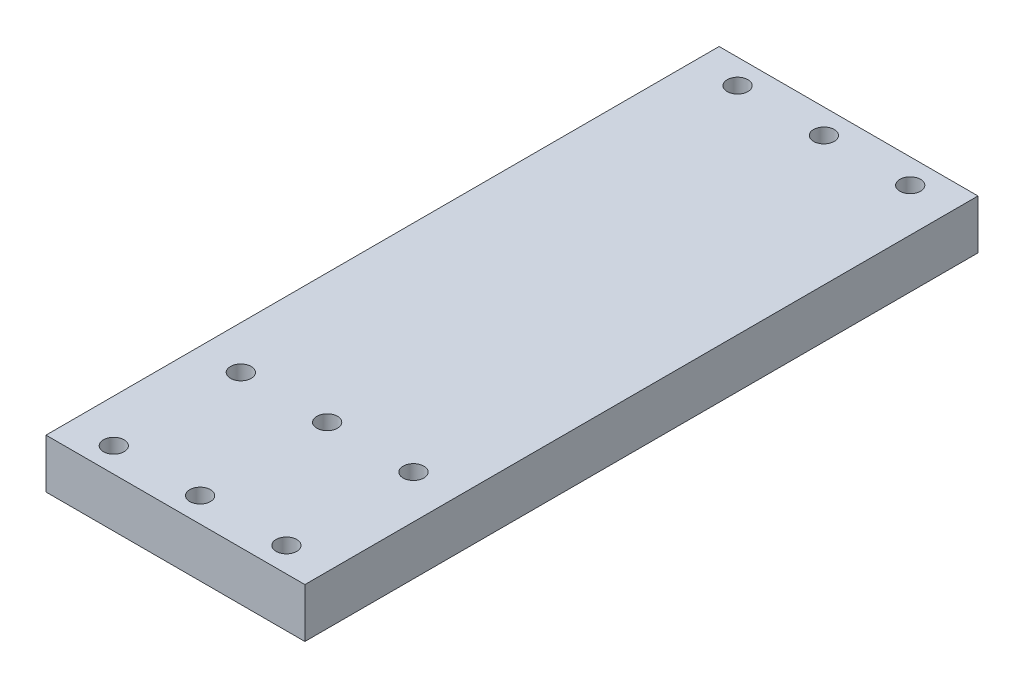
ISO-10303-21;
HEADER;
FILE_DESCRIPTION(('STEP AP214'),'2;1');
FILE_NAME('part.step','',(''),(''),'','','');
FILE_SCHEMA(('AUTOMOTIVE_DESIGN { 1 0 10303 214 1 1 1 1 }'));
ENDSEC;
DATA;
#1=APPLICATION_CONTEXT('core data for automotive mechanical design processes');
#2=APPLICATION_PROTOCOL_DEFINITION('international standard','automotive_design',2000,#1);
#3=PRODUCT_CONTEXT('',#1,'mechanical');
#4=PRODUCT('Part','Part','',(#3));
#5=PRODUCT_RELATED_PRODUCT_CATEGORY('part','',(#4));
#6=PRODUCT_DEFINITION_FORMATION('','',#4);
#7=PRODUCT_DEFINITION_CONTEXT('part definition',#1,'design');
#8=PRODUCT_DEFINITION('design','',#6,#7);
#9=PRODUCT_DEFINITION_SHAPE('','',#8);
#10=(LENGTH_UNIT() NAMED_UNIT(*) SI_UNIT(.MILLI.,.METRE.));
#11=(NAMED_UNIT(*) PLANE_ANGLE_UNIT() SI_UNIT($,.RADIAN.));
#12=(NAMED_UNIT(*) SI_UNIT($,.STERADIAN.) SOLID_ANGLE_UNIT());
#13=UNCERTAINTY_MEASURE_WITH_UNIT(LENGTH_MEASURE(1.E-05),#10,'distance_accuracy_value','');
#14=(GEOMETRIC_REPRESENTATION_CONTEXT(3) GLOBAL_UNCERTAINTY_ASSIGNED_CONTEXT((#13)) GLOBAL_UNIT_ASSIGNED_CONTEXT((#10,
#11,#12)) REPRESENTATION_CONTEXT('',''));
#15=CARTESIAN_POINT('',(0.,0.,0.));
#16=DIRECTION('',(0.,0.,1.));
#17=DIRECTION('',(1.,0.,0.));
#18=AXIS2_PLACEMENT_3D('',#15,#16,#17);
#19=CARTESIAN_POINT('',(25.,9.525,65.));
#20=DIRECTION('',(-1.,0.,0.));
#21=DIRECTION('',(0.,0.,1.));
#22=AXIS2_PLACEMENT_3D('',#19,#20,#21);
#23=PLANE('',#22);
#24=DIRECTION('',(0.,0.,-1.));
#25=VECTOR('',#24,1.);
#26=CARTESIAN_POINT('',(25.,0.,65.));
#27=LINE('',#26,#25);
#28=CARTESIAN_POINT('',(25.,0.,65.));
#29=VERTEX_POINT('',#28);
#30=CARTESIAN_POINT('',(25.,0.,-65.));
#31=VERTEX_POINT('',#30);
#32=EDGE_CURVE('E102',#29,#31,#27,.T.);
#33=ORIENTED_EDGE('',*,*,#32,.T.);
#34=DIRECTION('',(0.,-1.,0.));
#35=VECTOR('',#34,1.);
#36=CARTESIAN_POINT('',(25.,9.525,-65.));
#37=LINE('',#36,#35);
#38=CARTESIAN_POINT('',(25.,9.525,-65.));
#39=VERTEX_POINT('',#38);
#40=EDGE_CURVE('E11',#39,#31,#37,.T.);
#41=ORIENTED_EDGE('',*,*,#40,.F.);
#42=DIRECTION('',(0.,0.,-1.));
#43=VECTOR('',#42,1.);
#44=CARTESIAN_POINT('',(25.,9.525,65.));
#45=LINE('',#44,#43);
#46=CARTESIAN_POINT('',(25.,9.525,65.));
#47=VERTEX_POINT('',#46);
#48=EDGE_CURVE('E90',#47,#39,#45,.T.);
#49=ORIENTED_EDGE('',*,*,#48,.F.);
#50=DIRECTION('',(0.,-1.,0.));
#51=VECTOR('',#50,1.);
#52=CARTESIAN_POINT('',(25.,9.525,65.));
#53=LINE('',#52,#51);
#54=EDGE_CURVE('E98',#47,#29,#53,.T.);
#55=ORIENTED_EDGE('',*,*,#54,.T.);
#56=EDGE_LOOP('',(#33,#41,#49,#55));
#57=FACE_BOUND('',#56,.T.);
#58=ADVANCED_FACE('F39',(#57),#23,.F.);
#59=CARTESIAN_POINT('',(-25.,9.525,-65.));
#60=DIRECTION('',(0.,0.,1.));
#61=DIRECTION('',(1.,0.,0.));
#62=AXIS2_PLACEMENT_3D('',#59,#60,#61);
#63=PLANE('',#62);
#64=DIRECTION('',(-1.,0.,0.));
#65=VECTOR('',#64,1.);
#66=CARTESIAN_POINT('',(-25.,0.,-65.));
#67=LINE('',#66,#65);
#68=CARTESIAN_POINT('',(-25.,0.,-65.));
#69=VERTEX_POINT('',#68);
#70=EDGE_CURVE('E94',#31,#69,#67,.T.);
#71=ORIENTED_EDGE('',*,*,#70,.T.);
#72=DIRECTION('',(0.,-1.,0.));
#73=VECTOR('',#72,1.);
#74=CARTESIAN_POINT('',(-25.,9.525,-65.));
#75=LINE('',#74,#73);
#76=CARTESIAN_POINT('',(-25.,9.525,-65.));
#77=VERTEX_POINT('',#76);
#78=EDGE_CURVE('E47',#77,#69,#75,.T.);
#79=ORIENTED_EDGE('',*,*,#78,.F.);
#80=DIRECTION('',(-1.,0.,0.));
#81=VECTOR('',#80,1.);
#82=CARTESIAN_POINT('',(-25.,9.525,-65.));
#83=LINE('',#82,#81);
#84=EDGE_CURVE('E85',#39,#77,#83,.T.);
#85=ORIENTED_EDGE('',*,*,#84,.F.);
#86=ORIENTED_EDGE('',*,*,#40,.T.);
#87=EDGE_LOOP('',(#71,#79,#85,#86));
#88=FACE_BOUND('',#87,.T.);
#89=ADVANCED_FACE('F93',(#88),#63,.F.);
#90=CARTESIAN_POINT('',(-25.,9.525,65.));
#91=DIRECTION('',(1.,0.,0.));
#92=DIRECTION('',(0.,0.,-1.));
#93=AXIS2_PLACEMENT_3D('',#90,#91,#92);
#94=PLANE('',#93);
#95=DIRECTION('',(0.,0.,1.));
#96=VECTOR('',#95,1.);
#97=CARTESIAN_POINT('',(-25.,0.,65.));
#98=LINE('',#97,#96);
#99=CARTESIAN_POINT('',(-25.,0.,65.));
#100=VERTEX_POINT('',#99);
#101=EDGE_CURVE('E72',#69,#100,#98,.T.);
#102=ORIENTED_EDGE('',*,*,#101,.T.);
#103=DIRECTION('',(0.,-1.,0.));
#104=VECTOR('',#103,1.);
#105=CARTESIAN_POINT('',(-25.,9.525,65.));
#106=LINE('',#105,#104);
#107=CARTESIAN_POINT('',(-25.,9.525,65.));
#108=VERTEX_POINT('',#107);
#109=EDGE_CURVE('E95',#108,#100,#106,.T.);
#110=ORIENTED_EDGE('',*,*,#109,.F.);
#111=DIRECTION('',(0.,0.,1.));
#112=VECTOR('',#111,1.);
#113=CARTESIAN_POINT('',(-25.,9.525,65.));
#114=LINE('',#113,#112);
#115=EDGE_CURVE('E88',#77,#108,#114,.T.);
#116=ORIENTED_EDGE('',*,*,#115,.F.);
#117=ORIENTED_EDGE('',*,*,#78,.T.);
#118=EDGE_LOOP('',(#102,#110,#116,#117));
#119=FACE_BOUND('',#118,.T.);
#120=ADVANCED_FACE('F96',(#119),#94,.F.);
#121=CARTESIAN_POINT('',(-25.,9.525,65.));
#122=DIRECTION('',(0.,0.,-1.));
#123=DIRECTION('',(-1.,0.,0.));
#124=AXIS2_PLACEMENT_3D('',#121,#122,#123);
#125=PLANE('',#124);
#126=DIRECTION('',(1.,0.,0.));
#127=VECTOR('',#126,1.);
#128=CARTESIAN_POINT('',(-25.,0.,65.));
#129=LINE('',#128,#127);
#130=EDGE_CURVE('E78',#100,#29,#129,.T.);
#131=ORIENTED_EDGE('',*,*,#130,.T.);
#132=ORIENTED_EDGE('',*,*,#54,.F.);
#133=DIRECTION('',(1.,0.,0.));
#134=VECTOR('',#133,1.);
#135=CARTESIAN_POINT('',(-25.,9.525,65.));
#136=LINE('',#135,#134);
#137=EDGE_CURVE('E55',#108,#47,#136,.T.);
#138=ORIENTED_EDGE('',*,*,#137,.F.);
#139=ORIENTED_EDGE('',*,*,#109,.T.);
#140=EDGE_LOOP('',(#131,#132,#138,#139));
#141=FACE_BOUND('',#140,.T.);
#142=ADVANCED_FACE('F110',(#141),#125,.F.);
#143=CARTESIAN_POINT('',(0.,9.525,0.));
#144=DIRECTION('',(0.,-1.,0.));
#145=DIRECTION('',(0.,0.,-1.));
#146=AXIS2_PLACEMENT_3D('',#143,#144,#145);
#147=PLANE('',#146);
#148=CARTESIAN_POINT('',(-16.67,9.525,-60.2375));
#149=DIRECTION('',(0.,1.,0.));
#150=DIRECTION('',(0.,0.,1.));
#151=AXIS2_PLACEMENT_3D('',#148,#149,#150);
#152=CIRCLE('',#151,1.99999999999999);
#153=CARTESIAN_POINT('',(-16.67,9.525,-58.2375));
#154=VERTEX_POINT('',#153);
#155=EDGE_CURVE('E166',#154,#154,#152,.T.);
#156=ORIENTED_EDGE('',*,*,#155,.F.);
#157=EDGE_LOOP('',(#156));
#158=FACE_BOUND('',#157,.T.);
#159=CARTESIAN_POINT('',(0.,9.525,-60.2375));
#160=DIRECTION('',(0.,1.,0.));
#161=DIRECTION('',(0.,0.,1.));
#162=AXIS2_PLACEMENT_3D('',#159,#160,#161);
#163=CIRCLE('',#162,1.99999999999999);
#164=CARTESIAN_POINT('',(0.,9.525,-58.2375));
#165=VERTEX_POINT('',#164);
#166=EDGE_CURVE('E160',#165,#165,#163,.T.);
#167=ORIENTED_EDGE('',*,*,#166,.F.);
#168=EDGE_LOOP('',(#167));
#169=FACE_BOUND('',#168,.T.);
#170=CARTESIAN_POINT('',(16.67,9.525,-60.2375));
#171=DIRECTION('',(0.,1.,0.));
#172=DIRECTION('',(0.,0.,1.));
#173=AXIS2_PLACEMENT_3D('',#170,#171,#172);
#174=CIRCLE('',#173,1.99999999999999);
#175=CARTESIAN_POINT('',(16.67,9.525,-58.2375));
#176=VERTEX_POINT('',#175);
#177=EDGE_CURVE('E154',#176,#176,#174,.T.);
#178=ORIENTED_EDGE('',*,*,#177,.F.);
#179=EDGE_LOOP('',(#178));
#180=FACE_BOUND('',#179,.T.);
#181=CARTESIAN_POINT('',(16.6700000000001,9.525,35.7));
#182=DIRECTION('',(0.,1.,0.));
#183=DIRECTION('',(0.,0.,1.));
#184=AXIS2_PLACEMENT_3D('',#181,#182,#183);
#185=CIRCLE('',#184,1.99999999999999);
#186=CARTESIAN_POINT('',(16.6700000000001,9.525,37.7));
#187=VERTEX_POINT('',#186);
#188=EDGE_CURVE('E148',#187,#187,#185,.T.);
#189=ORIENTED_EDGE('',*,*,#188,.F.);
#190=EDGE_LOOP('',(#189));
#191=FACE_BOUND('',#190,.T.);
#192=CARTESIAN_POINT('',(1.29568922228012E-13,9.525,35.7));
#193=DIRECTION('',(0.,1.,0.));
#194=DIRECTION('',(0.,0.,1.));
#195=AXIS2_PLACEMENT_3D('',#192,#193,#194);
#196=CIRCLE('',#195,1.99999999999999);
#197=CARTESIAN_POINT('',(1.29568922228012E-13,9.525,37.7));
#198=VERTEX_POINT('',#197);
#199=EDGE_CURVE('E142',#198,#198,#196,.T.);
#200=ORIENTED_EDGE('',*,*,#199,.F.);
#201=EDGE_LOOP('',(#200));
#202=FACE_BOUND('',#201,.T.);
#203=CARTESIAN_POINT('',(-16.6699999999999,9.525,35.7));
#204=DIRECTION('',(0.,1.,0.));
#205=DIRECTION('',(0.,0.,1.));
#206=AXIS2_PLACEMENT_3D('',#203,#204,#205);
#207=CIRCLE('',#206,1.99999999999999);
#208=CARTESIAN_POINT('',(-16.6699999999999,9.525,37.7));
#209=VERTEX_POINT('',#208);
#210=EDGE_CURVE('E136',#209,#209,#207,.T.);
#211=ORIENTED_EDGE('',*,*,#210,.F.);
#212=EDGE_LOOP('',(#211));
#213=FACE_BOUND('',#212,.T.);
#214=CARTESIAN_POINT('',(-16.6699999999995,9.525,60.2375));
#215=DIRECTION('',(0.,1.,0.));
#216=DIRECTION('',(0.,0.,1.));
#217=AXIS2_PLACEMENT_3D('',#214,#215,#216);
#218=CIRCLE('',#217,1.99999999999999);
#219=CARTESIAN_POINT('',(-16.6699999999995,9.525,62.2375));
#220=VERTEX_POINT('',#219);
#221=EDGE_CURVE('E130',#220,#220,#218,.T.);
#222=ORIENTED_EDGE('',*,*,#221,.F.);
#223=EDGE_LOOP('',(#222));
#224=FACE_BOUND('',#223,.T.);
#225=CARTESIAN_POINT('',(5.05500881455915E-13,9.525,60.2375));
#226=DIRECTION('',(0.,1.,0.));
#227=DIRECTION('',(0.,0.,1.));
#228=AXIS2_PLACEMENT_3D('',#225,#226,#227);
#229=CIRCLE('',#228,1.99999999999999);
#230=CARTESIAN_POINT('',(5.05500881455915E-13,9.525,62.2375));
#231=VERTEX_POINT('',#230);
#232=EDGE_CURVE('E124',#231,#231,#229,.T.);
#233=ORIENTED_EDGE('',*,*,#232,.F.);
#234=EDGE_LOOP('',(#233));
#235=FACE_BOUND('',#234,.T.);
#236=CARTESIAN_POINT('',(16.6700000000005,9.525,60.2375));
#237=DIRECTION('',(0.,1.,0.));
#238=DIRECTION('',(0.,0.,1.));
#239=AXIS2_PLACEMENT_3D('',#236,#237,#238);
#240=CIRCLE('',#239,1.99999999999999);
#241=CARTESIAN_POINT('',(16.6700000000005,9.525,62.2375));
#242=VERTEX_POINT('',#241);
#243=EDGE_CURVE('E118',#242,#242,#240,.T.);
#244=ORIENTED_EDGE('',*,*,#243,.F.);
#245=EDGE_LOOP('',(#244));
#246=FACE_BOUND('',#245,.T.);
#247=ORIENTED_EDGE('',*,*,#48,.T.);
#248=ORIENTED_EDGE('',*,*,#84,.T.);
#249=ORIENTED_EDGE('',*,*,#115,.T.);
#250=ORIENTED_EDGE('',*,*,#137,.T.);
#251=EDGE_LOOP('',(#247,#248,#249,#250));
#252=FACE_BOUND('',#251,.T.);
#253=ADVANCED_FACE('F86',(#158,#169,#180,#191,#202,#213,#224,#235,#246,#252),#147,.F.);
#254=CARTESIAN_POINT('',(0.,0.,0.));
#255=DIRECTION('',(0.,-1.,0.));
#256=DIRECTION('',(0.,0.,-1.));
#257=AXIS2_PLACEMENT_3D('',#254,#255,#256);
#258=PLANE('',#257);
#259=CARTESIAN_POINT('',(-16.67,0.,-60.2375));
#260=DIRECTION('',(0.,1.,0.));
#261=DIRECTION('',(0.,0.,1.));
#262=AXIS2_PLACEMENT_3D('',#259,#260,#261);
#263=CIRCLE('',#262,2.);
#264=CARTESIAN_POINT('',(-16.67,0.,-58.2375));
#265=VERTEX_POINT('',#264);
#266=EDGE_CURVE('E163',#265,#265,#263,.T.);
#267=ORIENTED_EDGE('',*,*,#266,.T.);
#268=EDGE_LOOP('',(#267));
#269=FACE_BOUND('',#268,.T.);
#270=CARTESIAN_POINT('',(0.,0.,-60.2375));
#271=DIRECTION('',(0.,1.,0.));
#272=DIRECTION('',(0.,0.,1.));
#273=AXIS2_PLACEMENT_3D('',#270,#271,#272);
#274=CIRCLE('',#273,2.);
#275=CARTESIAN_POINT('',(0.,0.,-58.2375));
#276=VERTEX_POINT('',#275);
#277=EDGE_CURVE('E157',#276,#276,#274,.T.);
#278=ORIENTED_EDGE('',*,*,#277,.T.);
#279=EDGE_LOOP('',(#278));
#280=FACE_BOUND('',#279,.T.);
#281=CARTESIAN_POINT('',(16.67,0.,-60.2375));
#282=DIRECTION('',(0.,1.,0.));
#283=DIRECTION('',(0.,0.,1.));
#284=AXIS2_PLACEMENT_3D('',#281,#282,#283);
#285=CIRCLE('',#284,2.);
#286=CARTESIAN_POINT('',(16.67,0.,-58.2375));
#287=VERTEX_POINT('',#286);
#288=EDGE_CURVE('E151',#287,#287,#285,.T.);
#289=ORIENTED_EDGE('',*,*,#288,.T.);
#290=EDGE_LOOP('',(#289));
#291=FACE_BOUND('',#290,.T.);
#292=CARTESIAN_POINT('',(16.6700000000001,0.,35.7));
#293=DIRECTION('',(0.,1.,0.));
#294=DIRECTION('',(0.,0.,1.));
#295=AXIS2_PLACEMENT_3D('',#292,#293,#294);
#296=CIRCLE('',#295,2.);
#297=CARTESIAN_POINT('',(16.6700000000001,0.,37.7));
#298=VERTEX_POINT('',#297);
#299=EDGE_CURVE('E145',#298,#298,#296,.T.);
#300=ORIENTED_EDGE('',*,*,#299,.T.);
#301=EDGE_LOOP('',(#300));
#302=FACE_BOUND('',#301,.T.);
#303=CARTESIAN_POINT('',(1.29568922228012E-13,0.,35.7));
#304=DIRECTION('',(0.,1.,0.));
#305=DIRECTION('',(0.,0.,1.));
#306=AXIS2_PLACEMENT_3D('',#303,#304,#305);
#307=CIRCLE('',#306,2.);
#308=CARTESIAN_POINT('',(1.29568922228012E-13,0.,37.7));
#309=VERTEX_POINT('',#308);
#310=EDGE_CURVE('E139',#309,#309,#307,.T.);
#311=ORIENTED_EDGE('',*,*,#310,.T.);
#312=EDGE_LOOP('',(#311));
#313=FACE_BOUND('',#312,.T.);
#314=CARTESIAN_POINT('',(-16.6699999999999,0.,35.7));
#315=DIRECTION('',(0.,1.,0.));
#316=DIRECTION('',(0.,0.,1.));
#317=AXIS2_PLACEMENT_3D('',#314,#315,#316);
#318=CIRCLE('',#317,2.);
#319=CARTESIAN_POINT('',(-16.6699999999999,0.,37.7));
#320=VERTEX_POINT('',#319);
#321=EDGE_CURVE('E133',#320,#320,#318,.T.);
#322=ORIENTED_EDGE('',*,*,#321,.T.);
#323=EDGE_LOOP('',(#322));
#324=FACE_BOUND('',#323,.T.);
#325=CARTESIAN_POINT('',(-16.6699999999995,0.,60.2375));
#326=DIRECTION('',(0.,1.,0.));
#327=DIRECTION('',(0.,0.,1.));
#328=AXIS2_PLACEMENT_3D('',#325,#326,#327);
#329=CIRCLE('',#328,2.);
#330=CARTESIAN_POINT('',(-16.6699999999995,0.,62.2375));
#331=VERTEX_POINT('',#330);
#332=EDGE_CURVE('E127',#331,#331,#329,.T.);
#333=ORIENTED_EDGE('',*,*,#332,.T.);
#334=EDGE_LOOP('',(#333));
#335=FACE_BOUND('',#334,.T.);
#336=CARTESIAN_POINT('',(5.05500881455915E-13,0.,60.2375));
#337=DIRECTION('',(0.,1.,0.));
#338=DIRECTION('',(0.,0.,1.));
#339=AXIS2_PLACEMENT_3D('',#336,#337,#338);
#340=CIRCLE('',#339,2.);
#341=CARTESIAN_POINT('',(5.05500881455915E-13,0.,62.2375));
#342=VERTEX_POINT('',#341);
#343=EDGE_CURVE('E121',#342,#342,#340,.T.);
#344=ORIENTED_EDGE('',*,*,#343,.T.);
#345=EDGE_LOOP('',(#344));
#346=FACE_BOUND('',#345,.T.);
#347=CARTESIAN_POINT('',(16.6700000000005,0.,60.2375));
#348=DIRECTION('',(0.,1.,0.));
#349=DIRECTION('',(0.,0.,1.));
#350=AXIS2_PLACEMENT_3D('',#347,#348,#349);
#351=CIRCLE('',#350,2.);
#352=CARTESIAN_POINT('',(16.6700000000005,0.,62.2375));
#353=VERTEX_POINT('',#352);
#354=EDGE_CURVE('E105',#353,#353,#351,.T.);
#355=ORIENTED_EDGE('',*,*,#354,.T.);
#356=EDGE_LOOP('',(#355));
#357=FACE_BOUND('',#356,.T.);
#358=ORIENTED_EDGE('',*,*,#32,.F.);
#359=ORIENTED_EDGE('',*,*,#130,.F.);
#360=ORIENTED_EDGE('',*,*,#101,.F.);
#361=ORIENTED_EDGE('',*,*,#70,.F.);
#362=EDGE_LOOP('',(#358,#359,#360,#361));
#363=FACE_BOUND('',#362,.T.);
#364=ADVANCED_FACE('F113',(#269,#280,#291,#302,#313,#324,#335,#346,#357,#363),#258,.T.);
#365=CARTESIAN_POINT('',(16.6700000000005,9.525,60.2375));
#366=DIRECTION('',(0.,1.,0.));
#367=DIRECTION('',(0.,0.,1.));
#368=AXIS2_PLACEMENT_3D('',#365,#366,#367);
#369=CYLINDRICAL_SURFACE('',#368,1.99999999999999);
#370=ORIENTED_EDGE('',*,*,#354,.F.);
#371=EDGE_LOOP('',(#370));
#372=FACE_BOUND('',#371,.T.);
#373=ORIENTED_EDGE('',*,*,#243,.T.);
#374=EDGE_LOOP('',(#373));
#375=FACE_BOUND('',#374,.T.);
#376=ADVANCED_FACE('F191',(#372,#375),#369,.F.);
#377=CARTESIAN_POINT('',(5.05500881455915E-13,9.525,60.2375));
#378=DIRECTION('',(0.,1.,0.));
#379=DIRECTION('',(0.,0.,1.));
#380=AXIS2_PLACEMENT_3D('',#377,#378,#379);
#381=CYLINDRICAL_SURFACE('',#380,1.99999999999999);
#382=ORIENTED_EDGE('',*,*,#343,.F.);
#383=EDGE_LOOP('',(#382));
#384=FACE_BOUND('',#383,.T.);
#385=ORIENTED_EDGE('',*,*,#232,.T.);
#386=EDGE_LOOP('',(#385));
#387=FACE_BOUND('',#386,.T.);
#388=ADVANCED_FACE('F193',(#384,#387),#381,.F.);
#389=CARTESIAN_POINT('',(-16.6699999999995,9.525,60.2375));
#390=DIRECTION('',(0.,1.,0.));
#391=DIRECTION('',(0.,0.,1.));
#392=AXIS2_PLACEMENT_3D('',#389,#390,#391);
#393=CYLINDRICAL_SURFACE('',#392,1.99999999999999);
#394=ORIENTED_EDGE('',*,*,#332,.F.);
#395=EDGE_LOOP('',(#394));
#396=FACE_BOUND('',#395,.T.);
#397=ORIENTED_EDGE('',*,*,#221,.T.);
#398=EDGE_LOOP('',(#397));
#399=FACE_BOUND('',#398,.T.);
#400=ADVANCED_FACE('F200',(#396,#399),#393,.F.);
#401=CARTESIAN_POINT('',(-16.6699999999999,9.525,35.7));
#402=DIRECTION('',(0.,1.,0.));
#403=DIRECTION('',(0.,0.,1.));
#404=AXIS2_PLACEMENT_3D('',#401,#402,#403);
#405=CYLINDRICAL_SURFACE('',#404,1.99999999999999);
#406=ORIENTED_EDGE('',*,*,#321,.F.);
#407=EDGE_LOOP('',(#406));
#408=FACE_BOUND('',#407,.T.);
#409=ORIENTED_EDGE('',*,*,#210,.T.);
#410=EDGE_LOOP('',(#409));
#411=FACE_BOUND('',#410,.T.);
#412=ADVANCED_FACE('F250',(#408,#411),#405,.F.);
#413=CARTESIAN_POINT('',(1.29568922228012E-13,9.525,35.7));
#414=DIRECTION('',(0.,1.,0.));
#415=DIRECTION('',(0.,0.,1.));
#416=AXIS2_PLACEMENT_3D('',#413,#414,#415);
#417=CYLINDRICAL_SURFACE('',#416,1.99999999999999);
#418=ORIENTED_EDGE('',*,*,#310,.F.);
#419=EDGE_LOOP('',(#418));
#420=FACE_BOUND('',#419,.T.);
#421=ORIENTED_EDGE('',*,*,#199,.T.);
#422=EDGE_LOOP('',(#421));
#423=FACE_BOUND('',#422,.T.);
#424=ADVANCED_FACE('F260',(#420,#423),#417,.F.);
#425=CARTESIAN_POINT('',(16.6700000000001,9.525,35.7));
#426=DIRECTION('',(0.,1.,0.));
#427=DIRECTION('',(0.,0.,1.));
#428=AXIS2_PLACEMENT_3D('',#425,#426,#427);
#429=CYLINDRICAL_SURFACE('',#428,1.99999999999999);
#430=ORIENTED_EDGE('',*,*,#299,.F.);
#431=EDGE_LOOP('',(#430));
#432=FACE_BOUND('',#431,.T.);
#433=ORIENTED_EDGE('',*,*,#188,.T.);
#434=EDGE_LOOP('',(#433));
#435=FACE_BOUND('',#434,.T.);
#436=ADVANCED_FACE('F270',(#432,#435),#429,.F.);
#437=CARTESIAN_POINT('',(16.67,9.525,-60.2375));
#438=DIRECTION('',(0.,1.,0.));
#439=DIRECTION('',(0.,0.,1.));
#440=AXIS2_PLACEMENT_3D('',#437,#438,#439);
#441=CYLINDRICAL_SURFACE('',#440,1.99999999999999);
#442=ORIENTED_EDGE('',*,*,#288,.F.);
#443=EDGE_LOOP('',(#442));
#444=FACE_BOUND('',#443,.T.);
#445=ORIENTED_EDGE('',*,*,#177,.T.);
#446=EDGE_LOOP('',(#445));
#447=FACE_BOUND('',#446,.T.);
#448=ADVANCED_FACE('F280',(#444,#447),#441,.F.);
#449=CARTESIAN_POINT('',(0.,9.525,-60.2375));
#450=DIRECTION('',(0.,1.,0.));
#451=DIRECTION('',(0.,0.,1.));
#452=AXIS2_PLACEMENT_3D('',#449,#450,#451);
#453=CYLINDRICAL_SURFACE('',#452,1.99999999999999);
#454=ORIENTED_EDGE('',*,*,#277,.F.);
#455=EDGE_LOOP('',(#454));
#456=FACE_BOUND('',#455,.T.);
#457=ORIENTED_EDGE('',*,*,#166,.T.);
#458=EDGE_LOOP('',(#457));
#459=FACE_BOUND('',#458,.T.);
#460=ADVANCED_FACE('F290',(#456,#459),#453,.F.);
#461=CARTESIAN_POINT('',(-16.67,9.525,-60.2375));
#462=DIRECTION('',(0.,1.,0.));
#463=DIRECTION('',(0.,0.,1.));
#464=AXIS2_PLACEMENT_3D('',#461,#462,#463);
#465=CYLINDRICAL_SURFACE('',#464,1.99999999999999);
#466=ORIENTED_EDGE('',*,*,#266,.F.);
#467=EDGE_LOOP('',(#466));
#468=FACE_BOUND('',#467,.T.);
#469=ORIENTED_EDGE('',*,*,#155,.T.);
#470=EDGE_LOOP('',(#469));
#471=FACE_BOUND('',#470,.T.);
#472=ADVANCED_FACE('F170',(#468,#471),#465,.F.);
#473=CLOSED_SHELL('',(#58,#89,#120,#142,#253,#364,#376,#388,#400,#412,#424,#436,#448,#460,#472));
#474=MANIFOLD_SOLID_BREP('B2',#473);
#475=ADVANCED_BREP_SHAPE_REPRESENTATION('',(#18,#474),#14);
#476=SHAPE_DEFINITION_REPRESENTATION(#9,#475);
ENDSEC;
END-ISO-10303-21;
